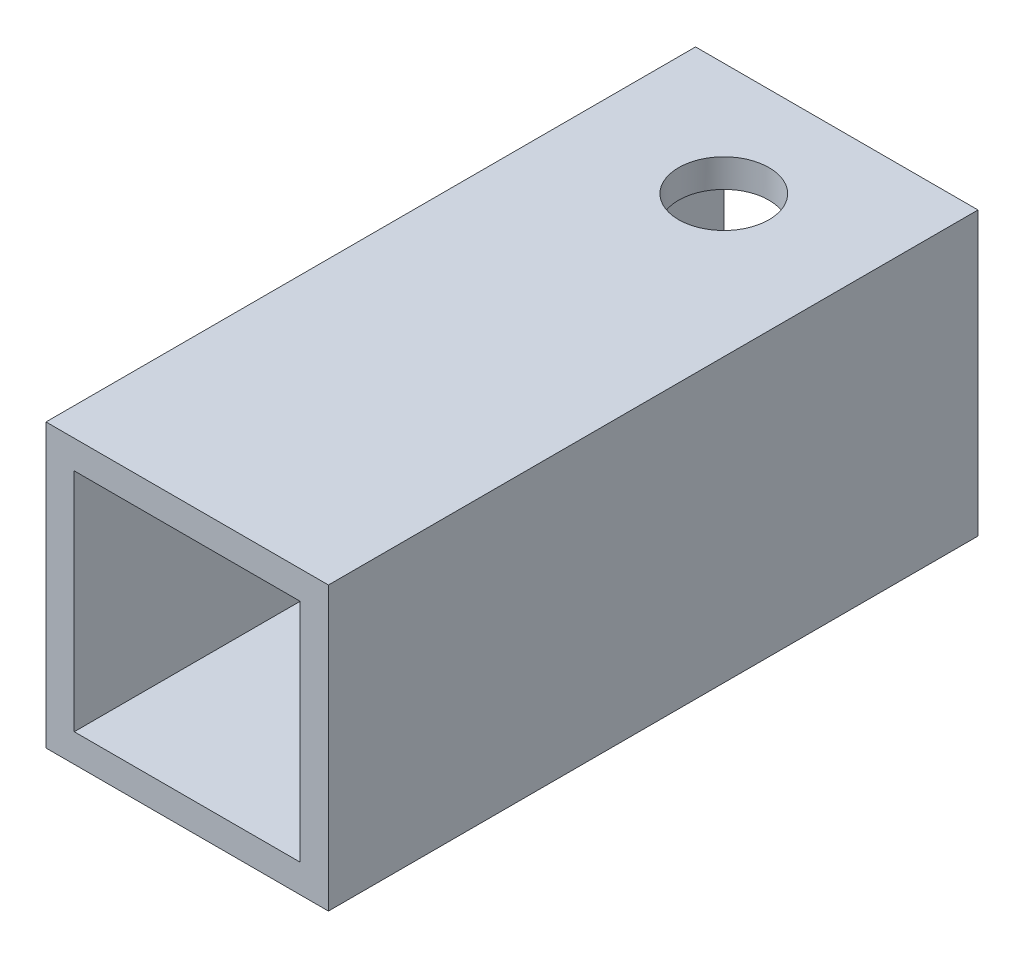
ISO-10303-21;
HEADER;
FILE_DESCRIPTION(('STEP AP214'),'2;1');
FILE_NAME('part.step','',(''),(''),'','','');
FILE_SCHEMA(('AUTOMOTIVE_DESIGN { 1 0 10303 214 1 1 1 1 }'));
ENDSEC;
DATA;
#1=APPLICATION_CONTEXT('core data for automotive mechanical design processes');
#2=APPLICATION_PROTOCOL_DEFINITION('international standard','automotive_design',2000,#1);
#3=PRODUCT_CONTEXT('',#1,'mechanical');
#4=PRODUCT('Part','Part','',(#3));
#5=PRODUCT_RELATED_PRODUCT_CATEGORY('part','',(#4));
#6=PRODUCT_DEFINITION_FORMATION('','',#4);
#7=PRODUCT_DEFINITION_CONTEXT('part definition',#1,'design');
#8=PRODUCT_DEFINITION('design','',#6,#7);
#9=PRODUCT_DEFINITION_SHAPE('','',#8);
#10=(LENGTH_UNIT() NAMED_UNIT(*) SI_UNIT(.MILLI.,.METRE.));
#11=(NAMED_UNIT(*) PLANE_ANGLE_UNIT() SI_UNIT($,.RADIAN.));
#12=(NAMED_UNIT(*) SI_UNIT($,.STERADIAN.) SOLID_ANGLE_UNIT());
#13=UNCERTAINTY_MEASURE_WITH_UNIT(LENGTH_MEASURE(1.E-05),#10,'distance_accuracy_value','');
#14=(GEOMETRIC_REPRESENTATION_CONTEXT(3) GLOBAL_UNCERTAINTY_ASSIGNED_CONTEXT((#13)) GLOBAL_UNIT_ASSIGNED_CONTEXT((#10,
#11,#12)) REPRESENTATION_CONTEXT('',''));
#15=CARTESIAN_POINT('',(0.,0.,0.));
#16=DIRECTION('',(0.,0.,1.));
#17=DIRECTION('',(1.,0.,0.));
#18=AXIS2_PLACEMENT_3D('',#15,#16,#17);
#19=CARTESIAN_POINT('',(0.,0.,23.));
#20=DIRECTION('',(0.,0.,1.));
#21=DIRECTION('',(1.,0.,0.));
#22=AXIS2_PLACEMENT_3D('',#19,#20,#21);
#23=PLANE('',#22);
#24=DIRECTION('',(0.,1.,0.));
#25=VECTOR('',#24,1.);
#26=CARTESIAN_POINT('',(5.,-5.,23.));
#27=LINE('',#26,#25);
#28=CARTESIAN_POINT('',(5.,-5.,23.));
#29=VERTEX_POINT('',#28);
#30=CARTESIAN_POINT('',(5.,5.,23.));
#31=VERTEX_POINT('',#30);
#32=EDGE_CURVE('E161',#29,#31,#27,.T.);
#33=ORIENTED_EDGE('',*,*,#32,.T.);
#34=DIRECTION('',(-1.,0.,0.));
#35=VECTOR('',#34,1.);
#36=CARTESIAN_POINT('',(-5.,5.,23.));
#37=LINE('',#36,#35);
#38=CARTESIAN_POINT('',(-5.,5.,23.));
#39=VERTEX_POINT('',#38);
#40=EDGE_CURVE('E164',#31,#39,#37,.T.);
#41=ORIENTED_EDGE('',*,*,#40,.T.);
#42=DIRECTION('',(0.,-1.,0.));
#43=VECTOR('',#42,1.);
#44=CARTESIAN_POINT('',(-5.,-5.,23.));
#45=LINE('',#44,#43);
#46=CARTESIAN_POINT('',(-5.,-5.,23.));
#47=VERTEX_POINT('',#46);
#48=EDGE_CURVE('E167',#39,#47,#45,.T.);
#49=ORIENTED_EDGE('',*,*,#48,.T.);
#50=DIRECTION('',(1.,0.,0.));
#51=VECTOR('',#50,1.);
#52=CARTESIAN_POINT('',(-5.,-5.,23.));
#53=LINE('',#52,#51);
#54=EDGE_CURVE('E169',#47,#29,#53,.T.);
#55=ORIENTED_EDGE('',*,*,#54,.T.);
#56=EDGE_LOOP('',(#33,#41,#49,#55));
#57=FACE_BOUND('',#56,.T.);
#58=DIRECTION('',(-1.,0.,0.));
#59=VECTOR('',#58,1.);
#60=CARTESIAN_POINT('',(0.,4.,23.));
#61=LINE('',#60,#59);
#62=CARTESIAN_POINT('',(4.,4.,23.));
#63=VERTEX_POINT('',#62);
#64=CARTESIAN_POINT('',(-4.,4.,23.));
#65=VERTEX_POINT('',#64);
#66=EDGE_CURVE('E131',#63,#65,#61,.T.);
#67=ORIENTED_EDGE('',*,*,#66,.F.);
#68=DIRECTION('',(0.,1.,0.));
#69=VECTOR('',#68,1.);
#70=CARTESIAN_POINT('',(4.,0.,23.));
#71=LINE('',#70,#69);
#72=CARTESIAN_POINT('',(4.,-4.,23.));
#73=VERTEX_POINT('',#72);
#74=EDGE_CURVE('E123',#73,#63,#71,.T.);
#75=ORIENTED_EDGE('',*,*,#74,.F.);
#76=DIRECTION('',(1.,0.,0.));
#77=VECTOR('',#76,1.);
#78=CARTESIAN_POINT('',(0.,-4.,23.));
#79=LINE('',#78,#77);
#80=CARTESIAN_POINT('',(-4.,-4.,23.));
#81=VERTEX_POINT('',#80);
#82=EDGE_CURVE('E145',#81,#73,#79,.T.);
#83=ORIENTED_EDGE('',*,*,#82,.F.);
#84=DIRECTION('',(0.,-1.,0.));
#85=VECTOR('',#84,1.);
#86=CARTESIAN_POINT('',(-4.,0.,23.));
#87=LINE('',#86,#85);
#88=EDGE_CURVE('E143',#65,#81,#87,.T.);
#89=ORIENTED_EDGE('',*,*,#88,.F.);
#90=EDGE_LOOP('',(#67,#75,#83,#89));
#91=FACE_BOUND('',#90,.T.);
#92=ADVANCED_FACE('F57',(#57,#91),#23,.T.);
#93=CARTESIAN_POINT('',(0.,0.,0.));
#94=DIRECTION('',(0.,0.,1.));
#95=DIRECTION('',(1.,0.,0.));
#96=AXIS2_PLACEMENT_3D('',#93,#94,#95);
#97=PLANE('',#96);
#98=DIRECTION('',(0.,1.,0.));
#99=VECTOR('',#98,1.);
#100=CARTESIAN_POINT('',(5.,-5.,0.));
#101=LINE('',#100,#99);
#102=CARTESIAN_POINT('',(5.,-5.,0.));
#103=VERTEX_POINT('',#102);
#104=CARTESIAN_POINT('',(5.,5.,0.));
#105=VERTEX_POINT('',#104);
#106=EDGE_CURVE('E139',#103,#105,#101,.T.);
#107=ORIENTED_EDGE('',*,*,#106,.F.);
#108=DIRECTION('',(1.,0.,0.));
#109=VECTOR('',#108,1.);
#110=CARTESIAN_POINT('',(-5.,-5.,0.));
#111=LINE('',#110,#109);
#112=CARTESIAN_POINT('',(-5.,-5.,0.));
#113=VERTEX_POINT('',#112);
#114=EDGE_CURVE('E165',#113,#103,#111,.T.);
#115=ORIENTED_EDGE('',*,*,#114,.F.);
#116=DIRECTION('',(0.,-1.,0.));
#117=VECTOR('',#116,1.);
#118=CARTESIAN_POINT('',(-5.,-5.,0.));
#119=LINE('',#118,#117);
#120=CARTESIAN_POINT('',(-5.,5.,0.));
#121=VERTEX_POINT('',#120);
#122=EDGE_CURVE('E176',#121,#113,#119,.T.);
#123=ORIENTED_EDGE('',*,*,#122,.F.);
#124=DIRECTION('',(-1.,0.,0.));
#125=VECTOR('',#124,1.);
#126=CARTESIAN_POINT('',(-5.,5.,0.));
#127=LINE('',#126,#125);
#128=EDGE_CURVE('E174',#105,#121,#127,.T.);
#129=ORIENTED_EDGE('',*,*,#128,.F.);
#130=EDGE_LOOP('',(#107,#115,#123,#129));
#131=FACE_BOUND('',#130,.T.);
#132=DIRECTION('',(0.,1.,0.));
#133=VECTOR('',#132,1.);
#134=CARTESIAN_POINT('',(4.,0.,0.));
#135=LINE('',#134,#133);
#136=CARTESIAN_POINT('',(4.,-4.,0.));
#137=VERTEX_POINT('',#136);
#138=CARTESIAN_POINT('',(4.,4.,0.));
#139=VERTEX_POINT('',#138);
#140=EDGE_CURVE('E81',#137,#139,#135,.T.);
#141=ORIENTED_EDGE('',*,*,#140,.T.);
#142=DIRECTION('',(-1.,0.,0.));
#143=VECTOR('',#142,1.);
#144=CARTESIAN_POINT('',(0.,4.,0.));
#145=LINE('',#144,#143);
#146=CARTESIAN_POINT('',(-4.,4.,0.));
#147=VERTEX_POINT('',#146);
#148=EDGE_CURVE('E138',#139,#147,#145,.T.);
#149=ORIENTED_EDGE('',*,*,#148,.T.);
#150=DIRECTION('',(0.,-1.,0.));
#151=VECTOR('',#150,1.);
#152=CARTESIAN_POINT('',(-4.,0.,0.));
#153=LINE('',#152,#151);
#154=CARTESIAN_POINT('',(-4.,-4.,0.));
#155=VERTEX_POINT('',#154);
#156=EDGE_CURVE('E153',#147,#155,#153,.T.);
#157=ORIENTED_EDGE('',*,*,#156,.T.);
#158=DIRECTION('',(1.,0.,0.));
#159=VECTOR('',#158,1.);
#160=CARTESIAN_POINT('',(0.,-4.,0.));
#161=LINE('',#160,#159);
#162=EDGE_CURVE('E132',#155,#137,#161,.T.);
#163=ORIENTED_EDGE('',*,*,#162,.T.);
#164=EDGE_LOOP('',(#141,#149,#157,#163));
#165=FACE_BOUND('',#164,.T.);
#166=ADVANCED_FACE('F195',(#131,#165),#97,.F.);
#167=CARTESIAN_POINT('',(5.,-5.,23.));
#168=DIRECTION('',(-1.,0.,0.));
#169=DIRECTION('',(0.,0.,1.));
#170=AXIS2_PLACEMENT_3D('',#167,#168,#169);
#171=PLANE('',#170);
#172=ORIENTED_EDGE('',*,*,#106,.T.);
#173=DIRECTION('',(0.,0.,-1.));
#174=VECTOR('',#173,1.);
#175=CARTESIAN_POINT('',(5.,5.,23.));
#176=LINE('',#175,#174);
#177=EDGE_CURVE('E12',#31,#105,#176,.T.);
#178=ORIENTED_EDGE('',*,*,#177,.F.);
#179=ORIENTED_EDGE('',*,*,#32,.F.);
#180=DIRECTION('',(0.,0.,-1.));
#181=VECTOR('',#180,1.);
#182=CARTESIAN_POINT('',(5.,-5.,23.));
#183=LINE('',#182,#181);
#184=EDGE_CURVE('E171',#29,#103,#183,.T.);
#185=ORIENTED_EDGE('',*,*,#184,.T.);
#186=EDGE_LOOP('',(#172,#178,#179,#185));
#187=FACE_BOUND('',#186,.T.);
#188=ADVANCED_FACE('F59',(#187),#171,.F.);
#189=CARTESIAN_POINT('',(-5.,5.,23.));
#190=DIRECTION('',(0.,-1.,0.));
#191=DIRECTION('',(0.,0.,-1.));
#192=AXIS2_PLACEMENT_3D('',#189,#190,#191);
#193=PLANE('',#192);
#194=CARTESIAN_POINT('',(0.,5.,4.));
#195=DIRECTION('',(0.,1.,0.));
#196=DIRECTION('',(0.,0.,1.));
#197=AXIS2_PLACEMENT_3D('',#194,#195,#196);
#198=CIRCLE('',#197,1.6);
#199=CARTESIAN_POINT('',(0.,5.,5.6));
#200=VERTEX_POINT('',#199);
#201=EDGE_CURVE('E232',#200,#200,#198,.T.);
#202=ORIENTED_EDGE('',*,*,#201,.F.);
#203=EDGE_LOOP('',(#202));
#204=FACE_BOUND('',#203,.T.);
#205=ORIENTED_EDGE('',*,*,#128,.T.);
#206=DIRECTION('',(0.,0.,-1.));
#207=VECTOR('',#206,1.);
#208=CARTESIAN_POINT('',(-5.,5.,23.));
#209=LINE('',#208,#207);
#210=EDGE_CURVE('E66',#39,#121,#209,.T.);
#211=ORIENTED_EDGE('',*,*,#210,.F.);
#212=ORIENTED_EDGE('',*,*,#40,.F.);
#213=ORIENTED_EDGE('',*,*,#177,.T.);
#214=EDGE_LOOP('',(#205,#211,#212,#213));
#215=FACE_BOUND('',#214,.T.);
#216=ADVANCED_FACE('F205',(#204,#215),#193,.F.);
#217=CARTESIAN_POINT('',(-5.,-5.,23.));
#218=DIRECTION('',(1.,0.,0.));
#219=DIRECTION('',(0.,0.,-1.));
#220=AXIS2_PLACEMENT_3D('',#217,#218,#219);
#221=PLANE('',#220);
#222=ORIENTED_EDGE('',*,*,#122,.T.);
#223=DIRECTION('',(0.,0.,-1.));
#224=VECTOR('',#223,1.);
#225=CARTESIAN_POINT('',(-5.,-5.,23.));
#226=LINE('',#225,#224);
#227=EDGE_CURVE('E181',#47,#113,#226,.T.);
#228=ORIENTED_EDGE('',*,*,#227,.F.);
#229=ORIENTED_EDGE('',*,*,#48,.F.);
#230=ORIENTED_EDGE('',*,*,#210,.T.);
#231=EDGE_LOOP('',(#222,#228,#229,#230));
#232=FACE_BOUND('',#231,.T.);
#233=ADVANCED_FACE('F189',(#232),#221,.F.);
#234=CARTESIAN_POINT('',(-5.,-5.,23.));
#235=DIRECTION('',(0.,1.,0.));
#236=DIRECTION('',(0.,0.,1.));
#237=AXIS2_PLACEMENT_3D('',#234,#235,#236);
#238=PLANE('',#237);
#239=CARTESIAN_POINT('',(0.,-5.,4.));
#240=DIRECTION('',(0.,1.,0.));
#241=DIRECTION('',(0.,0.,1.));
#242=AXIS2_PLACEMENT_3D('',#239,#240,#241);
#243=CIRCLE('',#242,1.6);
#244=CARTESIAN_POINT('',(0.,-5.,5.6));
#245=VERTEX_POINT('',#244);
#246=EDGE_CURVE('E230',#245,#245,#243,.T.);
#247=ORIENTED_EDGE('',*,*,#246,.T.);
#248=EDGE_LOOP('',(#247));
#249=FACE_BOUND('',#248,.T.);
#250=ORIENTED_EDGE('',*,*,#114,.T.);
#251=ORIENTED_EDGE('',*,*,#184,.F.);
#252=ORIENTED_EDGE('',*,*,#54,.F.);
#253=ORIENTED_EDGE('',*,*,#227,.T.);
#254=EDGE_LOOP('',(#250,#251,#252,#253));
#255=FACE_BOUND('',#254,.T.);
#256=ADVANCED_FACE('F199',(#249,#255),#238,.F.);
#257=CARTESIAN_POINT('',(4.,0.,23.));
#258=DIRECTION('',(-1.,0.,0.));
#259=DIRECTION('',(0.,0.,1.));
#260=AXIS2_PLACEMENT_3D('',#257,#258,#259);
#261=PLANE('',#260);
#262=ORIENTED_EDGE('',*,*,#140,.F.);
#263=DIRECTION('',(0.,0.,-1.));
#264=VECTOR('',#263,1.);
#265=CARTESIAN_POINT('',(4.,-4.,23.));
#266=LINE('',#265,#264);
#267=EDGE_CURVE('E127',#73,#137,#266,.T.);
#268=ORIENTED_EDGE('',*,*,#267,.F.);
#269=ORIENTED_EDGE('',*,*,#74,.T.);
#270=DIRECTION('',(0.,0.,-1.));
#271=VECTOR('',#270,1.);
#272=CARTESIAN_POINT('',(4.,4.,23.));
#273=LINE('',#272,#271);
#274=EDGE_CURVE('E126',#63,#139,#273,.T.);
#275=ORIENTED_EDGE('',*,*,#274,.T.);
#276=EDGE_LOOP('',(#262,#268,#269,#275));
#277=FACE_BOUND('',#276,.T.);
#278=ADVANCED_FACE('F125',(#277),#261,.T.);
#279=CARTESIAN_POINT('',(0.,4.,23.));
#280=DIRECTION('',(0.,-1.,0.));
#281=DIRECTION('',(0.,0.,-1.));
#282=AXIS2_PLACEMENT_3D('',#279,#280,#281);
#283=PLANE('',#282);
#284=CARTESIAN_POINT('',(0.,4.,4.));
#285=DIRECTION('',(0.,-1.,0.));
#286=DIRECTION('',(0.,0.,-1.));
#287=AXIS2_PLACEMENT_3D('',#284,#285,#286);
#288=CIRCLE('',#287,1.6);
#289=CARTESIAN_POINT('',(0.,4.,2.4));
#290=VERTEX_POINT('',#289);
#291=EDGE_CURVE('E151',#290,#290,#288,.T.);
#292=ORIENTED_EDGE('',*,*,#291,.F.);
#293=EDGE_LOOP('',(#292));
#294=FACE_BOUND('',#293,.T.);
#295=ORIENTED_EDGE('',*,*,#148,.F.);
#296=ORIENTED_EDGE('',*,*,#274,.F.);
#297=ORIENTED_EDGE('',*,*,#66,.T.);
#298=DIRECTION('',(0.,0.,-1.));
#299=VECTOR('',#298,1.);
#300=CARTESIAN_POINT('',(-4.,4.,23.));
#301=LINE('',#300,#299);
#302=EDGE_CURVE('E140',#65,#147,#301,.T.);
#303=ORIENTED_EDGE('',*,*,#302,.T.);
#304=EDGE_LOOP('',(#295,#296,#297,#303));
#305=FACE_BOUND('',#304,.T.);
#306=ADVANCED_FACE('F135',(#294,#305),#283,.T.);
#307=CARTESIAN_POINT('',(-4.,0.,23.));
#308=DIRECTION('',(1.,0.,0.));
#309=DIRECTION('',(0.,0.,-1.));
#310=AXIS2_PLACEMENT_3D('',#307,#308,#309);
#311=PLANE('',#310);
#312=ORIENTED_EDGE('',*,*,#156,.F.);
#313=ORIENTED_EDGE('',*,*,#302,.F.);
#314=ORIENTED_EDGE('',*,*,#88,.T.);
#315=DIRECTION('',(0.,0.,-1.));
#316=VECTOR('',#315,1.);
#317=CARTESIAN_POINT('',(-4.,-4.,23.));
#318=LINE('',#317,#316);
#319=EDGE_CURVE('E73',#81,#155,#318,.T.);
#320=ORIENTED_EDGE('',*,*,#319,.T.);
#321=EDGE_LOOP('',(#312,#313,#314,#320));
#322=FACE_BOUND('',#321,.T.);
#323=ADVANCED_FACE('F244',(#322),#311,.T.);
#324=CARTESIAN_POINT('',(0.,-4.,23.));
#325=DIRECTION('',(0.,1.,0.));
#326=DIRECTION('',(0.,0.,1.));
#327=AXIS2_PLACEMENT_3D('',#324,#325,#326);
#328=PLANE('',#327);
#329=CARTESIAN_POINT('',(0.,-4.,4.));
#330=DIRECTION('',(0.,1.,0.));
#331=DIRECTION('',(0.,0.,1.));
#332=AXIS2_PLACEMENT_3D('',#329,#330,#331);
#333=CIRCLE('',#332,1.6);
#334=CARTESIAN_POINT('',(0.,-4.,5.6));
#335=VERTEX_POINT('',#334);
#336=EDGE_CURVE('E61',#335,#335,#333,.T.);
#337=ORIENTED_EDGE('',*,*,#336,.F.);
#338=EDGE_LOOP('',(#337));
#339=FACE_BOUND('',#338,.T.);
#340=ORIENTED_EDGE('',*,*,#162,.F.);
#341=ORIENTED_EDGE('',*,*,#319,.F.);
#342=ORIENTED_EDGE('',*,*,#82,.T.);
#343=ORIENTED_EDGE('',*,*,#267,.T.);
#344=EDGE_LOOP('',(#340,#341,#342,#343));
#345=FACE_BOUND('',#344,.T.);
#346=ADVANCED_FACE('F248',(#339,#345),#328,.T.);
#347=CARTESIAN_POINT('',(0.,-5.,4.));
#348=DIRECTION('',(0.,1.,0.));
#349=DIRECTION('',(0.,0.,1.));
#350=AXIS2_PLACEMENT_3D('',#347,#348,#349);
#351=CYLINDRICAL_SURFACE('',#350,1.6);
#352=ORIENTED_EDGE('',*,*,#336,.T.);
#353=EDGE_LOOP('',(#352));
#354=FACE_BOUND('',#353,.T.);
#355=ORIENTED_EDGE('',*,*,#246,.F.);
#356=EDGE_LOOP('',(#355));
#357=FACE_BOUND('',#356,.T.);
#358=ADVANCED_FACE('F254',(#354,#357),#351,.F.);
#359=ORIENTED_EDGE('',*,*,#291,.T.);
#360=EDGE_LOOP('',(#359));
#361=FACE_BOUND('',#360,.T.);
#362=ORIENTED_EDGE('',*,*,#201,.T.);
#363=EDGE_LOOP('',(#362));
#364=FACE_BOUND('',#363,.T.);
#365=ADVANCED_FACE('F240',(#361,#364),#351,.F.);
#366=CLOSED_SHELL('',(#92,#166,#188,#216,#233,#256,#278,#306,#323,#346,#358,#365));
#367=MANIFOLD_SOLID_BREP('B2',#366);
#368=ADVANCED_BREP_SHAPE_REPRESENTATION('',(#18,#367),#14);
#369=SHAPE_DEFINITION_REPRESENTATION(#9,#368);
ENDSEC;
END-ISO-10303-21;
